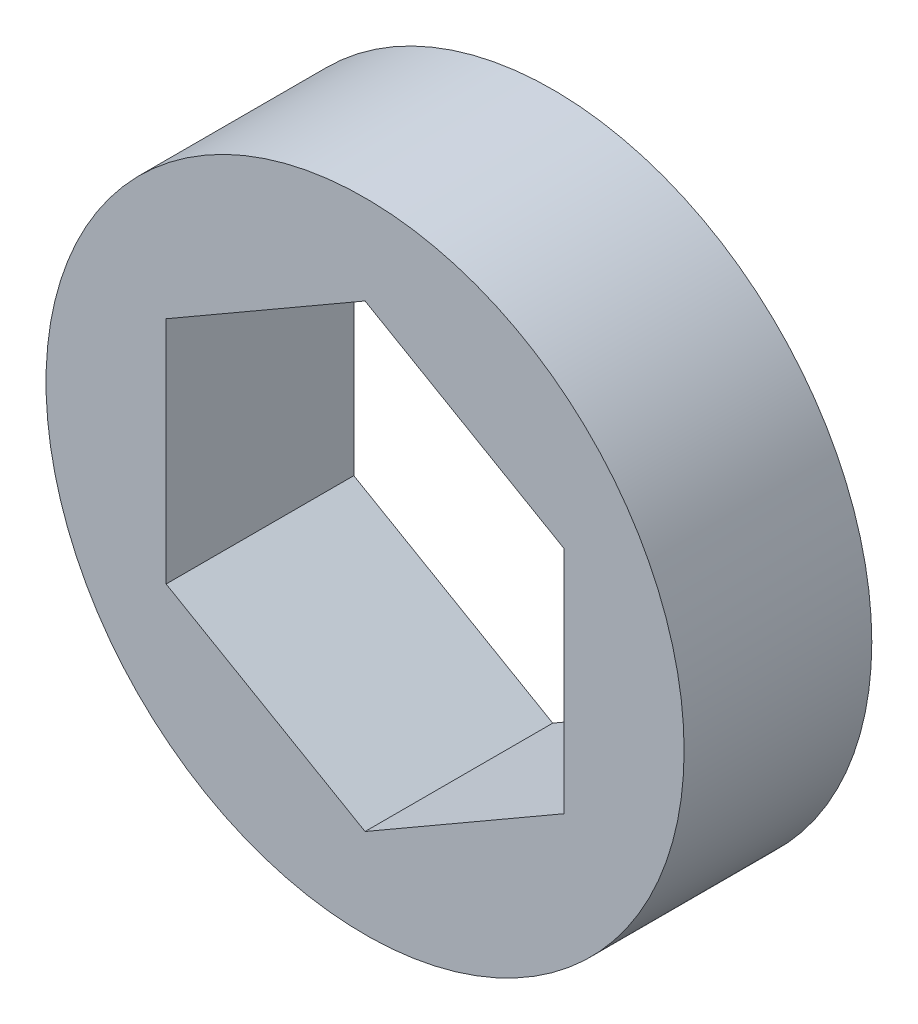
ISO-10303-21;
HEADER;
FILE_DESCRIPTION(('STEP AP214'),'2;1');
FILE_NAME('part.step','',(''),(''),'','','');
FILE_SCHEMA(('AUTOMOTIVE_DESIGN { 1 0 10303 214 1 1 1 1 }'));
ENDSEC;
DATA;
#1=APPLICATION_CONTEXT('core data for automotive mechanical design processes');
#2=APPLICATION_PROTOCOL_DEFINITION('international standard','automotive_design',2000,#1);
#3=PRODUCT_CONTEXT('',#1,'mechanical');
#4=PRODUCT('Part','Part','',(#3));
#5=PRODUCT_RELATED_PRODUCT_CATEGORY('part','',(#4));
#6=PRODUCT_DEFINITION_FORMATION('','',#4);
#7=PRODUCT_DEFINITION_CONTEXT('part definition',#1,'design');
#8=PRODUCT_DEFINITION('design','',#6,#7);
#9=PRODUCT_DEFINITION_SHAPE('','',#8);
#10=(LENGTH_UNIT() NAMED_UNIT(*) SI_UNIT(.MILLI.,.METRE.));
#11=(NAMED_UNIT(*) PLANE_ANGLE_UNIT() SI_UNIT($,.RADIAN.));
#12=(NAMED_UNIT(*) SI_UNIT($,.STERADIAN.) SOLID_ANGLE_UNIT());
#13=UNCERTAINTY_MEASURE_WITH_UNIT(LENGTH_MEASURE(1.E-05),#10,'distance_accuracy_value','');
#14=(GEOMETRIC_REPRESENTATION_CONTEXT(3) GLOBAL_UNCERTAINTY_ASSIGNED_CONTEXT((#13)) GLOBAL_UNIT_ASSIGNED_CONTEXT((#10,
#11,#12)) REPRESENTATION_CONTEXT('',''));
#15=CARTESIAN_POINT('',(0.,0.,0.));
#16=DIRECTION('',(0.,0.,1.));
#17=DIRECTION('',(1.,0.,0.));
#18=AXIS2_PLACEMENT_3D('',#15,#16,#17);
#19=CARTESIAN_POINT('',(0.,0.,6.35));
#20=DIRECTION('',(0.,0.,1.));
#21=DIRECTION('',(1.,0.,0.));
#22=AXIS2_PLACEMENT_3D('',#19,#20,#21);
#23=PLANE('',#22);
#24=CARTESIAN_POINT('',(0.,0.,6.35));
#25=DIRECTION('',(0.,0.,1.));
#26=DIRECTION('',(1.,0.,0.));
#27=AXIS2_PLACEMENT_3D('',#24,#25,#26);
#28=CIRCLE('',#27,10.795);
#29=CARTESIAN_POINT('',(10.795,0.,6.35));
#30=VERTEX_POINT('',#29);
#31=EDGE_CURVE('E11',#30,#30,#28,.T.);
#32=ORIENTED_EDGE('',*,*,#31,.T.);
#33=EDGE_LOOP('',(#32));
#34=FACE_BOUND('',#33,.T.);
#35=DIRECTION('',(-0.866025403784439,-0.5,0.));
#36=VECTOR('',#35,1.);
#37=CARTESIAN_POINT('',(0.,7.77228932383074,6.35));
#38=LINE('',#37,#36);
#39=CARTESIAN_POINT('',(0.,7.77228932383074,6.35));
#40=VERTEX_POINT('',#39);
#41=CARTESIAN_POINT('',(-6.731,3.88614466191537,6.35));
#42=VERTEX_POINT('',#41);
#43=EDGE_CURVE('E98',#40,#42,#38,.T.);
#44=ORIENTED_EDGE('',*,*,#43,.F.);
#45=DIRECTION('',(-0.866025403784439,0.5,0.));
#46=VECTOR('',#45,1.);
#47=CARTESIAN_POINT('',(6.731,3.88614466191537,6.35));
#48=LINE('',#47,#46);
#49=CARTESIAN_POINT('',(6.731,3.88614466191537,6.35));
#50=VERTEX_POINT('',#49);
#51=EDGE_CURVE('E90',#50,#40,#48,.T.);
#52=ORIENTED_EDGE('',*,*,#51,.F.);
#53=DIRECTION('',(0.,1.,0.));
#54=VECTOR('',#53,1.);
#55=CARTESIAN_POINT('',(6.731,-3.88614466191537,6.35));
#56=LINE('',#55,#54);
#57=CARTESIAN_POINT('',(6.731,-3.88614466191537,6.35));
#58=VERTEX_POINT('',#57);
#59=EDGE_CURVE('E118',#58,#50,#56,.T.);
#60=ORIENTED_EDGE('',*,*,#59,.F.);
#61=DIRECTION('',(0.866025403784439,0.5,0.));
#62=VECTOR('',#61,1.);
#63=CARTESIAN_POINT('',(0.,-7.77228932383074,6.35));
#64=LINE('',#63,#62);
#65=CARTESIAN_POINT('',(0.,-7.77228932383074,6.35));
#66=VERTEX_POINT('',#65);
#67=EDGE_CURVE('E116',#66,#58,#64,.T.);
#68=ORIENTED_EDGE('',*,*,#67,.F.);
#69=DIRECTION('',(0.866025403784439,-0.5,0.));
#70=VECTOR('',#69,1.);
#71=CARTESIAN_POINT('',(-6.731,-3.88614466191537,6.35));
#72=LINE('',#71,#70);
#73=CARTESIAN_POINT('',(-6.731,-3.88614466191537,6.35));
#74=VERTEX_POINT('',#73);
#75=EDGE_CURVE('E112',#74,#66,#72,.T.);
#76=ORIENTED_EDGE('',*,*,#75,.F.);
#77=DIRECTION('',(0.,-1.,0.));
#78=VECTOR('',#77,1.);
#79=CARTESIAN_POINT('',(-6.731,3.88614466191537,6.35));
#80=LINE('',#79,#78);
#81=EDGE_CURVE('E110',#42,#74,#80,.T.);
#82=ORIENTED_EDGE('',*,*,#81,.F.);
#83=EDGE_LOOP('',(#44,#52,#60,#68,#76,#82));
#84=FACE_BOUND('',#83,.T.);
#85=ADVANCED_FACE('F37',(#34,#84),#23,.T.);
#86=CARTESIAN_POINT('',(0.,0.,0.));
#87=DIRECTION('',(0.,0.,1.));
#88=DIRECTION('',(1.,0.,0.));
#89=AXIS2_PLACEMENT_3D('',#86,#87,#88);
#90=PLANE('',#89);
#91=CARTESIAN_POINT('',(0.,0.,0.));
#92=DIRECTION('',(0.,0.,1.));
#93=DIRECTION('',(1.,0.,0.));
#94=AXIS2_PLACEMENT_3D('',#91,#92,#93);
#95=CIRCLE('',#94,10.795);
#96=CARTESIAN_POINT('',(10.795,0.,0.));
#97=VERTEX_POINT('',#96);
#98=EDGE_CURVE('E41',#97,#97,#95,.T.);
#99=ORIENTED_EDGE('',*,*,#98,.F.);
#100=EDGE_LOOP('',(#99));
#101=FACE_BOUND('',#100,.T.);
#102=DIRECTION('',(-0.866025403784439,0.5,0.));
#103=VECTOR('',#102,1.);
#104=CARTESIAN_POINT('',(6.731,3.88614466191537,0.));
#105=LINE('',#104,#103);
#106=CARTESIAN_POINT('',(6.731,3.88614466191537,0.));
#107=VERTEX_POINT('',#106);
#108=CARTESIAN_POINT('',(0.,7.77228932383074,0.));
#109=VERTEX_POINT('',#108);
#110=EDGE_CURVE('E60',#107,#109,#105,.T.);
#111=ORIENTED_EDGE('',*,*,#110,.T.);
#112=DIRECTION('',(-0.866025403784439,-0.5,0.));
#113=VECTOR('',#112,1.);
#114=CARTESIAN_POINT('',(0.,7.77228932383074,0.));
#115=LINE('',#114,#113);
#116=CARTESIAN_POINT('',(-6.731,3.88614466191537,0.));
#117=VERTEX_POINT('',#116);
#118=EDGE_CURVE('E105',#109,#117,#115,.T.);
#119=ORIENTED_EDGE('',*,*,#118,.T.);
#120=DIRECTION('',(0.,-1.,0.));
#121=VECTOR('',#120,1.);
#122=CARTESIAN_POINT('',(-6.731,3.88614466191537,0.));
#123=LINE('',#122,#121);
#124=CARTESIAN_POINT('',(-6.731,-3.88614466191537,0.));
#125=VERTEX_POINT('',#124);
#126=EDGE_CURVE('E122',#117,#125,#123,.T.);
#127=ORIENTED_EDGE('',*,*,#126,.T.);
#128=DIRECTION('',(0.866025403784439,-0.5,0.));
#129=VECTOR('',#128,1.);
#130=CARTESIAN_POINT('',(-6.731,-3.88614466191537,0.));
#131=LINE('',#130,#129);
#132=CARTESIAN_POINT('',(0.,-7.77228932383074,0.));
#133=VERTEX_POINT('',#132);
#134=EDGE_CURVE('E125',#125,#133,#131,.T.);
#135=ORIENTED_EDGE('',*,*,#134,.T.);
#136=DIRECTION('',(0.866025403784439,0.5,0.));
#137=VECTOR('',#136,1.);
#138=CARTESIAN_POINT('',(0.,-7.77228932383074,0.));
#139=LINE('',#138,#137);
#140=CARTESIAN_POINT('',(6.731,-3.88614466191537,0.));
#141=VERTEX_POINT('',#140);
#142=EDGE_CURVE('E128',#133,#141,#139,.T.);
#143=ORIENTED_EDGE('',*,*,#142,.T.);
#144=DIRECTION('',(0.,1.,0.));
#145=VECTOR('',#144,1.);
#146=CARTESIAN_POINT('',(6.731,-3.88614466191537,0.));
#147=LINE('',#146,#145);
#148=EDGE_CURVE('E99',#141,#107,#147,.T.);
#149=ORIENTED_EDGE('',*,*,#148,.T.);
#150=EDGE_LOOP('',(#111,#119,#127,#135,#143,#149));
#151=FACE_BOUND('',#150,.T.);
#152=ADVANCED_FACE('F145',(#101,#151),#90,.F.);
#153=CARTESIAN_POINT('',(0.,0.,6.35));
#154=DIRECTION('',(0.,0.,-1.));
#155=DIRECTION('',(-1.,0.,0.));
#156=AXIS2_PLACEMENT_3D('',#153,#154,#155);
#157=CYLINDRICAL_SURFACE('',#156,10.795);
#158=ORIENTED_EDGE('',*,*,#31,.F.);
#159=EDGE_LOOP('',(#158));
#160=FACE_BOUND('',#159,.T.);
#161=ORIENTED_EDGE('',*,*,#98,.T.);
#162=EDGE_LOOP('',(#161));
#163=FACE_BOUND('',#162,.T.);
#164=ADVANCED_FACE('F39',(#160,#163),#157,.T.);
#165=CARTESIAN_POINT('',(6.731,3.88614466191537,6.35));
#166=DIRECTION('',(-0.5,-0.866025403784439,0.));
#167=DIRECTION('',(0.866025403784439,-0.5,0.));
#168=AXIS2_PLACEMENT_3D('',#165,#166,#167);
#169=PLANE('',#168);
#170=ORIENTED_EDGE('',*,*,#110,.F.);
#171=DIRECTION('',(0.,0.,-1.));
#172=VECTOR('',#171,1.);
#173=CARTESIAN_POINT('',(6.731,3.88614466191537,6.35));
#174=LINE('',#173,#172);
#175=EDGE_CURVE('E94',#50,#107,#174,.T.);
#176=ORIENTED_EDGE('',*,*,#175,.F.);
#177=ORIENTED_EDGE('',*,*,#51,.T.);
#178=DIRECTION('',(0.,0.,-1.));
#179=VECTOR('',#178,1.);
#180=CARTESIAN_POINT('',(0.,7.77228932383074,6.35));
#181=LINE('',#180,#179);
#182=EDGE_CURVE('E93',#40,#109,#181,.T.);
#183=ORIENTED_EDGE('',*,*,#182,.T.);
#184=EDGE_LOOP('',(#170,#176,#177,#183));
#185=FACE_BOUND('',#184,.T.);
#186=ADVANCED_FACE('F92',(#185),#169,.T.);
#187=CARTESIAN_POINT('',(0.,7.77228932383074,6.35));
#188=DIRECTION('',(0.5,-0.866025403784439,0.));
#189=DIRECTION('',(0.866025403784439,0.5,0.));
#190=AXIS2_PLACEMENT_3D('',#187,#188,#189);
#191=PLANE('',#190);
#192=ORIENTED_EDGE('',*,*,#118,.F.);
#193=ORIENTED_EDGE('',*,*,#182,.F.);
#194=ORIENTED_EDGE('',*,*,#43,.T.);
#195=DIRECTION('',(0.,0.,-1.));
#196=VECTOR('',#195,1.);
#197=CARTESIAN_POINT('',(-6.731,3.88614466191537,6.35));
#198=LINE('',#197,#196);
#199=EDGE_CURVE('E106',#42,#117,#198,.T.);
#200=ORIENTED_EDGE('',*,*,#199,.T.);
#201=EDGE_LOOP('',(#192,#193,#194,#200));
#202=FACE_BOUND('',#201,.T.);
#203=ADVANCED_FACE('F102',(#202),#191,.T.);
#204=CARTESIAN_POINT('',(-6.731,3.88614466191537,6.35));
#205=DIRECTION('',(1.,0.,0.));
#206=DIRECTION('',(0.,0.,-1.));
#207=AXIS2_PLACEMENT_3D('',#204,#205,#206);
#208=PLANE('',#207);
#209=ORIENTED_EDGE('',*,*,#126,.F.);
#210=ORIENTED_EDGE('',*,*,#199,.F.);
#211=ORIENTED_EDGE('',*,*,#81,.T.);
#212=DIRECTION('',(0.,0.,-1.));
#213=VECTOR('',#212,1.);
#214=CARTESIAN_POINT('',(-6.731,-3.88614466191537,6.35));
#215=LINE('',#214,#213);
#216=EDGE_CURVE('E137',#74,#125,#215,.T.);
#217=ORIENTED_EDGE('',*,*,#216,.T.);
#218=EDGE_LOOP('',(#209,#210,#211,#217));
#219=FACE_BOUND('',#218,.T.);
#220=ADVANCED_FACE('F141',(#219),#208,.T.);
#221=CARTESIAN_POINT('',(-6.731,-3.88614466191537,6.35));
#222=DIRECTION('',(0.5,0.866025403784438,0.));
#223=DIRECTION('',(-0.866025403784439,0.5,0.));
#224=AXIS2_PLACEMENT_3D('',#221,#222,#223);
#225=PLANE('',#224);
#226=ORIENTED_EDGE('',*,*,#134,.F.);
#227=ORIENTED_EDGE('',*,*,#216,.F.);
#228=ORIENTED_EDGE('',*,*,#75,.T.);
#229=DIRECTION('',(0.,0.,-1.));
#230=VECTOR('',#229,1.);
#231=CARTESIAN_POINT('',(0.,-7.77228932383074,6.35));
#232=LINE('',#231,#230);
#233=EDGE_CURVE('E135',#66,#133,#232,.T.);
#234=ORIENTED_EDGE('',*,*,#233,.T.);
#235=EDGE_LOOP('',(#226,#227,#228,#234));
#236=FACE_BOUND('',#235,.T.);
#237=ADVANCED_FACE('F153',(#236),#225,.T.);
#238=CARTESIAN_POINT('',(0.,-7.77228932383074,6.35));
#239=DIRECTION('',(-0.5,0.866025403784439,0.));
#240=DIRECTION('',(-0.866025403784439,-0.5,0.));
#241=AXIS2_PLACEMENT_3D('',#238,#239,#240);
#242=PLANE('',#241);
#243=ORIENTED_EDGE('',*,*,#142,.F.);
#244=ORIENTED_EDGE('',*,*,#233,.F.);
#245=ORIENTED_EDGE('',*,*,#67,.T.);
#246=DIRECTION('',(0.,0.,-1.));
#247=VECTOR('',#246,1.);
#248=CARTESIAN_POINT('',(6.731,-3.88614466191537,6.35));
#249=LINE('',#248,#247);
#250=EDGE_CURVE('E52',#58,#141,#249,.T.);
#251=ORIENTED_EDGE('',*,*,#250,.T.);
#252=EDGE_LOOP('',(#243,#244,#245,#251));
#253=FACE_BOUND('',#252,.T.);
#254=ADVANCED_FACE('F151',(#253),#242,.T.);
#255=CARTESIAN_POINT('',(6.731,-3.88614466191537,6.35));
#256=DIRECTION('',(-1.,0.,0.));
#257=DIRECTION('',(0.,-1.,0.));
#258=AXIS2_PLACEMENT_3D('',#255,#256,#257);
#259=PLANE('',#258);
#260=ORIENTED_EDGE('',*,*,#148,.F.);
#261=ORIENTED_EDGE('',*,*,#250,.F.);
#262=ORIENTED_EDGE('',*,*,#59,.T.);
#263=ORIENTED_EDGE('',*,*,#175,.T.);
#264=EDGE_LOOP('',(#260,#261,#262,#263));
#265=FACE_BOUND('',#264,.T.);
#266=ADVANCED_FACE('F147',(#265),#259,.T.);
#267=CLOSED_SHELL('',(#85,#152,#164,#186,#203,#220,#237,#254,#266));
#268=MANIFOLD_SOLID_BREP('B2',#267);
#269=ADVANCED_BREP_SHAPE_REPRESENTATION('',(#18,#268),#14);
#270=SHAPE_DEFINITION_REPRESENTATION(#9,#269);
ENDSEC;
END-ISO-10303-21;
